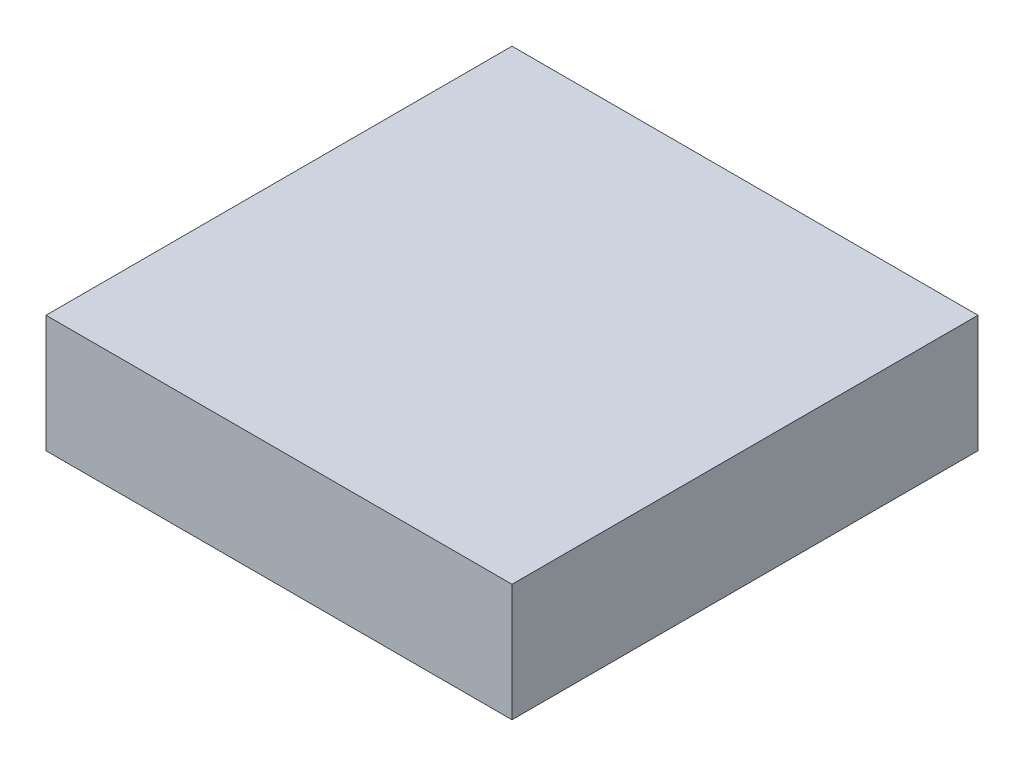
ISO-10303-21;
HEADER;
FILE_DESCRIPTION(('STEP AP214'),'2;1');
FILE_NAME('part.step','',(''),(''),'','','');
FILE_SCHEMA(('AUTOMOTIVE_DESIGN { 1 0 10303 214 1 1 1 1 }'));
ENDSEC;
DATA;
#1=APPLICATION_CONTEXT('core data for automotive mechanical design processes');
#2=APPLICATION_PROTOCOL_DEFINITION('international standard','automotive_design',2000,#1);
#3=PRODUCT_CONTEXT('',#1,'mechanical');
#4=PRODUCT('Part','Part','',(#3));
#5=PRODUCT_RELATED_PRODUCT_CATEGORY('part','',(#4));
#6=PRODUCT_DEFINITION_FORMATION('','',#4);
#7=PRODUCT_DEFINITION_CONTEXT('part definition',#1,'design');
#8=PRODUCT_DEFINITION('design','',#6,#7);
#9=PRODUCT_DEFINITION_SHAPE('','',#8);
#10=(LENGTH_UNIT() NAMED_UNIT(*) SI_UNIT(.MILLI.,.METRE.));
#11=(NAMED_UNIT(*) PLANE_ANGLE_UNIT() SI_UNIT($,.RADIAN.));
#12=(NAMED_UNIT(*) SI_UNIT($,.STERADIAN.) SOLID_ANGLE_UNIT());
#13=UNCERTAINTY_MEASURE_WITH_UNIT(LENGTH_MEASURE(1.E-05),#10,'distance_accuracy_value','');
#14=(GEOMETRIC_REPRESENTATION_CONTEXT(3) GLOBAL_UNCERTAINTY_ASSIGNED_CONTEXT((#13)) GLOBAL_UNIT_ASSIGNED_CONTEXT((#10,
#11,#12)) REPRESENTATION_CONTEXT('',''));
#15=CARTESIAN_POINT('',(0.,0.,0.));
#16=DIRECTION('',(0.,0.,1.));
#17=DIRECTION('',(1.,0.,0.));
#18=AXIS2_PLACEMENT_3D('',#15,#16,#17);
#19=CARTESIAN_POINT('',(0.,42.8625,0.));
#20=DIRECTION('',(1.,0.,0.));
#21=DIRECTION('',(0.,0.,-1.));
#22=AXIS2_PLACEMENT_3D('',#19,#20,#21);
#23=PLANE('',#22);
#24=DIRECTION('',(0.,0.,1.));
#25=VECTOR('',#24,1.);
#26=CARTESIAN_POINT('',(0.,0.,0.));
#27=LINE('',#26,#25);
#28=CARTESIAN_POINT('',(0.,0.,-170.18));
#29=VERTEX_POINT('',#28);
#30=CARTESIAN_POINT('',(0.,0.,0.));
#31=VERTEX_POINT('',#30);
#32=EDGE_CURVE('E96',#29,#31,#27,.T.);
#33=ORIENTED_EDGE('',*,*,#32,.T.);
#34=DIRECTION('',(0.,-1.,0.));
#35=VECTOR('',#34,1.);
#36=CARTESIAN_POINT('',(0.,42.8625,0.));
#37=LINE('',#36,#35);
#38=CARTESIAN_POINT('',(0.,42.8625,0.));
#39=VERTEX_POINT('',#38);
#40=EDGE_CURVE('E11',#39,#31,#37,.T.);
#41=ORIENTED_EDGE('',*,*,#40,.F.);
#42=DIRECTION('',(0.,0.,1.));
#43=VECTOR('',#42,1.);
#44=CARTESIAN_POINT('',(0.,42.8625,0.));
#45=LINE('',#44,#43);
#46=CARTESIAN_POINT('',(0.,42.8625,-170.18));
#47=VERTEX_POINT('',#46);
#48=EDGE_CURVE('E84',#47,#39,#45,.T.);
#49=ORIENTED_EDGE('',*,*,#48,.F.);
#50=DIRECTION('',(0.,-1.,0.));
#51=VECTOR('',#50,1.);
#52=CARTESIAN_POINT('',(0.,42.8625,-170.18));
#53=LINE('',#52,#51);
#54=EDGE_CURVE('E92',#47,#29,#53,.T.);
#55=ORIENTED_EDGE('',*,*,#54,.T.);
#56=EDGE_LOOP('',(#33,#41,#49,#55));
#57=FACE_BOUND('',#56,.T.);
#58=ADVANCED_FACE('F33',(#57),#23,.F.);
#59=CARTESIAN_POINT('',(0.,42.8625,0.));
#60=DIRECTION('',(0.,0.,-1.));
#61=DIRECTION('',(-1.,0.,0.));
#62=AXIS2_PLACEMENT_3D('',#59,#60,#61);
#63=PLANE('',#62);
#64=DIRECTION('',(1.,0.,0.));
#65=VECTOR('',#64,1.);
#66=CARTESIAN_POINT('',(0.,0.,0.));
#67=LINE('',#66,#65);
#68=CARTESIAN_POINT('',(170.18,0.,0.));
#69=VERTEX_POINT('',#68);
#70=EDGE_CURVE('E88',#31,#69,#67,.T.);
#71=ORIENTED_EDGE('',*,*,#70,.T.);
#72=DIRECTION('',(0.,-1.,0.));
#73=VECTOR('',#72,1.);
#74=CARTESIAN_POINT('',(170.18,42.8625,0.));
#75=LINE('',#74,#73);
#76=CARTESIAN_POINT('',(170.18,42.8625,0.));
#77=VERTEX_POINT('',#76);
#78=EDGE_CURVE('E41',#77,#69,#75,.T.);
#79=ORIENTED_EDGE('',*,*,#78,.F.);
#80=DIRECTION('',(1.,0.,0.));
#81=VECTOR('',#80,1.);
#82=CARTESIAN_POINT('',(0.,42.8625,0.));
#83=LINE('',#82,#81);
#84=EDGE_CURVE('E79',#39,#77,#83,.T.);
#85=ORIENTED_EDGE('',*,*,#84,.F.);
#86=ORIENTED_EDGE('',*,*,#40,.T.);
#87=EDGE_LOOP('',(#71,#79,#85,#86));
#88=FACE_BOUND('',#87,.T.);
#89=ADVANCED_FACE('F87',(#88),#63,.F.);
#90=CARTESIAN_POINT('',(170.18,42.8625,0.));
#91=DIRECTION('',(-1.,0.,0.));
#92=DIRECTION('',(0.,0.,1.));
#93=AXIS2_PLACEMENT_3D('',#90,#91,#92);
#94=PLANE('',#93);
#95=DIRECTION('',(0.,0.,-1.));
#96=VECTOR('',#95,1.);
#97=CARTESIAN_POINT('',(170.18,0.,0.));
#98=LINE('',#97,#96);
#99=CARTESIAN_POINT('',(170.18,0.,-170.18));
#100=VERTEX_POINT('',#99);
#101=EDGE_CURVE('E66',#69,#100,#98,.T.);
#102=ORIENTED_EDGE('',*,*,#101,.T.);
#103=DIRECTION('',(0.,-1.,0.));
#104=VECTOR('',#103,1.);
#105=CARTESIAN_POINT('',(170.18,42.8625,-170.18));
#106=LINE('',#105,#104);
#107=CARTESIAN_POINT('',(170.18,42.8625,-170.18));
#108=VERTEX_POINT('',#107);
#109=EDGE_CURVE('E89',#108,#100,#106,.T.);
#110=ORIENTED_EDGE('',*,*,#109,.F.);
#111=DIRECTION('',(0.,0.,-1.));
#112=VECTOR('',#111,1.);
#113=CARTESIAN_POINT('',(170.18,42.8625,0.));
#114=LINE('',#113,#112);
#115=EDGE_CURVE('E82',#77,#108,#114,.T.);
#116=ORIENTED_EDGE('',*,*,#115,.F.);
#117=ORIENTED_EDGE('',*,*,#78,.T.);
#118=EDGE_LOOP('',(#102,#110,#116,#117));
#119=FACE_BOUND('',#118,.T.);
#120=ADVANCED_FACE('F90',(#119),#94,.F.);
#121=CARTESIAN_POINT('',(0.,42.8625,-170.18));
#122=DIRECTION('',(0.,0.,1.));
#123=DIRECTION('',(1.,0.,0.));
#124=AXIS2_PLACEMENT_3D('',#121,#122,#123);
#125=PLANE('',#124);
#126=DIRECTION('',(-1.,0.,0.));
#127=VECTOR('',#126,1.);
#128=CARTESIAN_POINT('',(0.,0.,-170.18));
#129=LINE('',#128,#127);
#130=EDGE_CURVE('E72',#100,#29,#129,.T.);
#131=ORIENTED_EDGE('',*,*,#130,.T.);
#132=ORIENTED_EDGE('',*,*,#54,.F.);
#133=DIRECTION('',(-1.,0.,0.));
#134=VECTOR('',#133,1.);
#135=CARTESIAN_POINT('',(0.,42.8625,-170.18));
#136=LINE('',#135,#134);
#137=EDGE_CURVE('E49',#108,#47,#136,.T.);
#138=ORIENTED_EDGE('',*,*,#137,.F.);
#139=ORIENTED_EDGE('',*,*,#109,.T.);
#140=EDGE_LOOP('',(#131,#132,#138,#139));
#141=FACE_BOUND('',#140,.T.);
#142=ADVANCED_FACE('F103',(#141),#125,.F.);
#143=CARTESIAN_POINT('',(0.,42.8625,0.));
#144=DIRECTION('',(0.,-1.,0.));
#145=DIRECTION('',(0.,0.,-1.));
#146=AXIS2_PLACEMENT_3D('',#143,#144,#145);
#147=PLANE('',#146);
#148=ORIENTED_EDGE('',*,*,#48,.T.);
#149=ORIENTED_EDGE('',*,*,#84,.T.);
#150=ORIENTED_EDGE('',*,*,#115,.T.);
#151=ORIENTED_EDGE('',*,*,#137,.T.);
#152=EDGE_LOOP('',(#148,#149,#150,#151));
#153=FACE_BOUND('',#152,.T.);
#154=ADVANCED_FACE('F80',(#153),#147,.F.);
#155=CARTESIAN_POINT('',(0.,0.,0.));
#156=DIRECTION('',(0.,-1.,0.));
#157=DIRECTION('',(0.,0.,-1.));
#158=AXIS2_PLACEMENT_3D('',#155,#156,#157);
#159=PLANE('',#158);
#160=ORIENTED_EDGE('',*,*,#32,.F.);
#161=ORIENTED_EDGE('',*,*,#130,.F.);
#162=ORIENTED_EDGE('',*,*,#101,.F.);
#163=ORIENTED_EDGE('',*,*,#70,.F.);
#164=EDGE_LOOP('',(#160,#161,#162,#163));
#165=FACE_BOUND('',#164,.T.);
#166=ADVANCED_FACE('F106',(#165),#159,.T.);
#167=CLOSED_SHELL('',(#58,#89,#120,#142,#154,#166));
#168=MANIFOLD_SOLID_BREP('B2',#167);
#169=ADVANCED_BREP_SHAPE_REPRESENTATION('',(#18,#168),#14);
#170=SHAPE_DEFINITION_REPRESENTATION(#9,#169);
ENDSEC;
END-ISO-10303-21;
